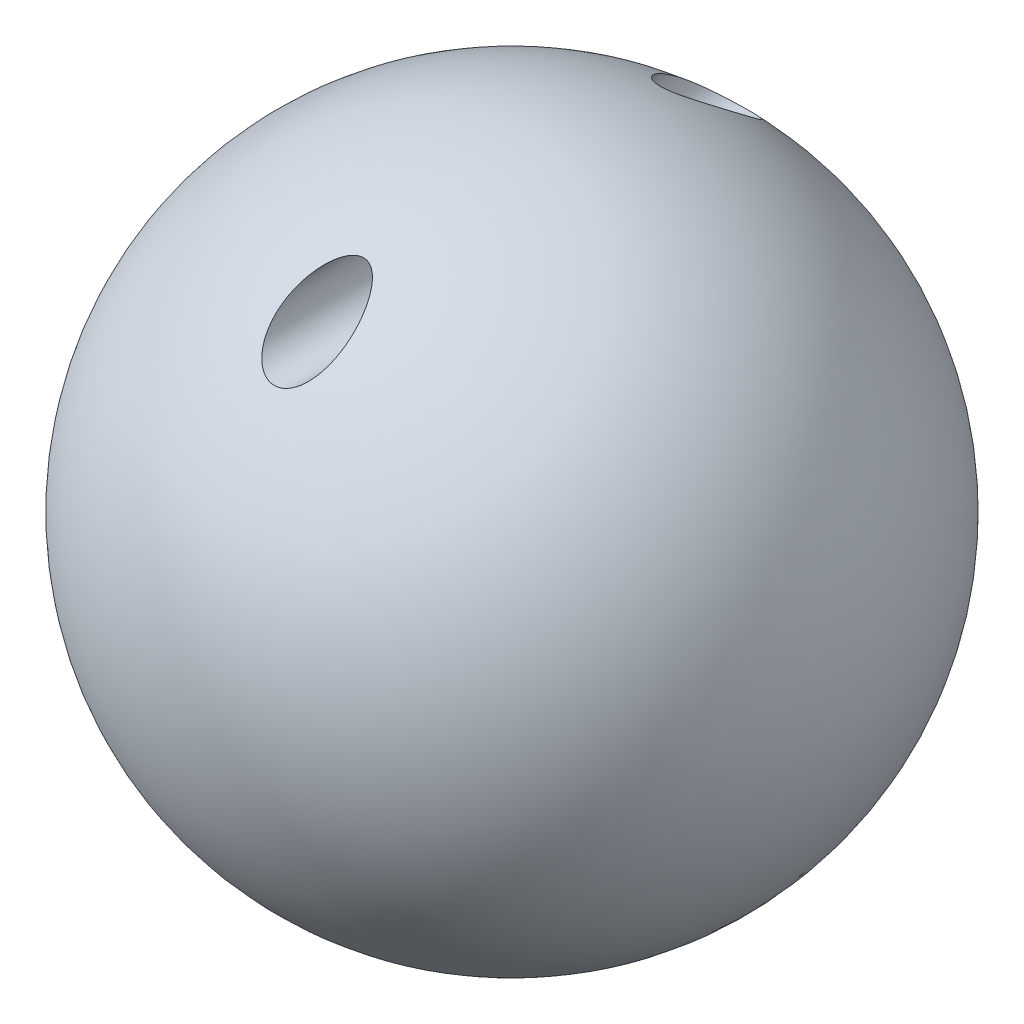
ISO-10303-21;
HEADER;
FILE_DESCRIPTION(('STEP AP214'),'2;1');
FILE_NAME('part.step','',(''),(''),'','','');
FILE_SCHEMA(('AUTOMOTIVE_DESIGN { 1 0 10303 214 1 1 1 1 }'));
ENDSEC;
DATA;
#1=APPLICATION_CONTEXT('core data for automotive mechanical design processes');
#2=APPLICATION_PROTOCOL_DEFINITION('international standard','automotive_design',2000,#1);
#3=PRODUCT_CONTEXT('',#1,'mechanical');
#4=PRODUCT('Part','Part','',(#3));
#5=PRODUCT_RELATED_PRODUCT_CATEGORY('part','',(#4));
#6=PRODUCT_DEFINITION_FORMATION('','',#4);
#7=PRODUCT_DEFINITION_CONTEXT('part definition',#1,'design');
#8=PRODUCT_DEFINITION('design','',#6,#7);
#9=PRODUCT_DEFINITION_SHAPE('','',#8);
#10=(LENGTH_UNIT() NAMED_UNIT(*) SI_UNIT(.MILLI.,.METRE.));
#11=(NAMED_UNIT(*) PLANE_ANGLE_UNIT() SI_UNIT($,.RADIAN.));
#12=(NAMED_UNIT(*) SI_UNIT($,.STERADIAN.) SOLID_ANGLE_UNIT());
#13=UNCERTAINTY_MEASURE_WITH_UNIT(LENGTH_MEASURE(1.E-05),#10,'distance_accuracy_value','');
#14=(GEOMETRIC_REPRESENTATION_CONTEXT(3) GLOBAL_UNCERTAINTY_ASSIGNED_CONTEXT((#13)) GLOBAL_UNIT_ASSIGNED_CONTEXT((#10,
#11,#12)) REPRESENTATION_CONTEXT('',''));
#15=CARTESIAN_POINT('',(0.,0.,0.));
#16=DIRECTION('',(0.,0.,1.));
#17=DIRECTION('',(1.,0.,0.));
#18=AXIS2_PLACEMENT_3D('',#15,#16,#17);
#19=CARTESIAN_POINT('',(0.,12.7,0.));
#20=DIRECTION('',(0.,-1.,0.));
#21=DIRECTION('',(-1.,0.,0.));
#22=AXIS2_PLACEMENT_3D('',#19,#20,#21);
#23=SPHERICAL_SURFACE('',#22,12.7);
#24=CARTESIAN_POINT('',(-0.759351797794241,21.7523752614738,-8.87512706169002));
#25=CARTESIAN_POINT('',(-0.831089058828256,21.8058833851729,-8.81441044199891));
#26=CARTESIAN_POINT('',(-0.893764035284983,21.8643975247287,-8.74737984286509));
#27=CARTESIAN_POINT('',(-1.00279947416906,21.9867451089927,-8.60538313509647));
#28=CARTESIAN_POINT('',(-1.04910022327068,22.0505969941645,-8.53038925231365));
#29=CARTESIAN_POINT('',(-1.14190497129659,22.2048570316088,-8.34660510253561));
#30=CARTESIAN_POINT('',(-1.18213659973077,22.2963442085907,-8.23558257322201));
#31=CARTESIAN_POINT('',(-1.24002629407971,22.479694113766,-8.00825521157405));
#32=CARTESIAN_POINT('',(-1.25765935501729,22.5715571453277,-7.89194467517421));
#33=CARTESIAN_POINT('',(-1.27054365411681,22.7227012819708,-7.69616496293528));
#34=CARTESIAN_POINT('',(-1.2713231152167,22.7825627278406,-7.61744272272749));
#35=CARTESIAN_POINT('',(-1.26465943195577,22.9009523752464,-7.45928794361259));
#36=CARTESIAN_POINT('',(-1.2572127918449,22.9594799991724,-7.37985511696935));
#37=CARTESIAN_POINT('',(-1.23437708432675,23.0747708462184,-7.22081856400652));
#38=CARTESIAN_POINT('',(-1.21898588579238,23.1315335915759,-7.14121479754105));
#39=CARTESIAN_POINT('',(-1.18030194023107,23.242856474525,-6.98246670863399));
#40=CARTESIAN_POINT('',(-1.15701299223983,23.2974176570352,-6.90332218386711));
#41=CARTESIAN_POINT('',(-1.09375369743324,23.4205830722512,-6.72157508373124));
#42=CARTESIAN_POINT('',(-1.05084801541627,23.4882779297423,-6.61933141149009));
#43=CARTESIAN_POINT('',(-0.974802945831967,23.5854245799967,-6.46927236860111));
#44=CARTESIAN_POINT('',(-0.947535090154582,23.6170490551763,-6.41984456759381));
#45=CARTESIAN_POINT('',(-0.888698460913649,23.6786127570565,-6.32253512244491));
#46=CARTESIAN_POINT('',(-0.857131935416161,23.7085528531438,-6.27465268621158));
#47=CARTESIAN_POINT('',(-0.785543464378302,23.7694881619773,-6.17612119924467));
#48=CARTESIAN_POINT('',(-0.744978991916814,23.8002559717045,-6.12572085683274));
#49=CARTESIAN_POINT('',(-0.656929986662447,23.8585339844194,-6.02915145517395));
#50=CARTESIAN_POINT('',(-0.609450174134059,23.886046386447,-5.98297954442653));
#51=CARTESIAN_POINT('',(-0.520225994465285,23.9296763974525,-5.90901644383442));
#52=CARTESIAN_POINT('',(-0.480360528112859,23.9468707706487,-5.87961735140805));
#53=CARTESIAN_POINT('',(-0.395935229509598,23.9778943268155,-5.82623858078711));
#54=CARTESIAN_POINT('',(-0.351384864578416,23.9917301164523,-5.80224826971908));
#55=CARTESIAN_POINT('',(-0.270000418134231,24.0118344641722,-5.76723453872909));
#56=CARTESIAN_POINT('',(-0.234184707323507,24.019135506102,-5.75446107612451));
#57=CARTESIAN_POINT('',(-0.160620439038307,24.0307063188933,-5.73417653749824));
#58=CARTESIAN_POINT('',(-0.122874251737679,24.0349797155472,-5.72665916712313));
#59=CARTESIAN_POINT('',(-0.0461818609156793,24.0401007785508,-5.71764704466955));
#60=CARTESIAN_POINT('',(-0.00722974686346041,24.0409274125914,-5.71618926869011));
#61=CARTESIAN_POINT('',(0.070312782016885,24.0390018181015,-5.71958051832246));
#62=CARTESIAN_POINT('',(0.108903084666963,24.0362485143265,-5.72443143876915));
#63=CARTESIAN_POINT('',(0.181429004468132,24.0278183138549,-5.73924125835918));
#64=CARTESIAN_POINT('',(0.215488819545904,24.02239553028,-5.74875591773294));
#65=CARTESIAN_POINT('',(0.281691904188706,24.0091827595708,-5.77185497928042));
#66=CARTESIAN_POINT('',(0.313834417952959,24.0013918462001,-5.78544097382856));
#67=CARTESIAN_POINT('',(0.396267600785165,23.9781324711754,-5.82581976863976));
#68=CARTESIAN_POINT('',(0.444689068093565,23.9609741642519,-5.85544073776631));
#69=CARTESIAN_POINT('',(0.535754480743906,23.9228839828702,-5.9205880234033));
#70=CARTESIAN_POINT('',(0.578378809676536,23.9019398285198,-5.95613352678529));
#71=CARTESIAN_POINT('',(0.653241987013958,23.8602017732355,-6.02626154975392));
#72=CARTESIAN_POINT('',(0.686111336783283,23.8397362770708,-6.06037794422098));
#73=CARTESIAN_POINT('',(0.748340185077619,23.7971512438757,-6.13073284296164));
#74=CARTESIAN_POINT('',(0.777697025905952,23.7750304747163,-6.1669729235948));
#75=CARTESIAN_POINT('',(0.861143183980542,23.7065891910786,-6.2780636955337));
#76=CARTESIAN_POINT('',(0.910531123599127,23.658235146698,-6.35520812099951));
#77=CARTESIAN_POINT('',(0.992604724565551,23.5646686234327,-6.50166350009603));
#78=CARTESIAN_POINT('',(1.02666048908448,23.5199632982005,-6.57056012379359));
#79=CARTESIAN_POINT('',(1.08780274335829,23.4281034005208,-6.70987160133703));
#80=CARTESIAN_POINT('',(1.1148845541012,23.3809472090838,-6.78028744031282));
#81=CARTESIAN_POINT('',(1.16250441116428,23.2845319233708,-6.92200787067093));
#82=CARTESIAN_POINT('',(1.18303409233275,23.2352702312003,-6.99331347836406));
#83=CARTESIAN_POINT('',(1.21768347557356,23.1349936600665,-7.13625082825087));
#84=CARTESIAN_POINT('',(1.23180280406911,23.0839786791129,-7.20788258920616));
#85=CARTESIAN_POINT('',(1.25406887893222,22.978315141959,-7.35405649266067));
#86=CARTESIAN_POINT('',(1.26194151046636,22.9236038193301,-7.42859522109121));
#87=CARTESIAN_POINT('',(1.2705006681116,22.8129062679086,-7.57717347254307));
#88=CARTESIAN_POINT('',(1.27118536505793,22.7569197182323,-7.65121286370435));
#89=CARTESIAN_POINT('',(1.26497575524037,22.6441979165995,-7.79816188662278));
#90=CARTESIAN_POINT('',(1.25809795201244,22.5874645608615,-7.87107362774595));
#91=CARTESIAN_POINT('',(1.23621541120595,22.4736641143297,-8.01534887923764));
#92=CARTESIAN_POINT('',(1.2212155709584,22.4165972451246,-8.08671329565273));
#93=CARTESIAN_POINT('',(1.17836773838381,22.2911981530331,-8.24152566417569));
#94=CARTESIAN_POINT('',(1.14853183711695,22.2229269753233,-8.32449104908718));
#95=CARTESIAN_POINT('',(1.0741983004497,22.0885295598913,-8.4855143814937));
#96=CARTESIAN_POINT('',(1.02971734779738,22.0224009751725,-8.5635777930916));
#97=CARTESIAN_POINT('',(0.937442163095681,21.9113478084707,-8.69305101851205));
#98=CARTESIAN_POINT('',(0.89340024794441,21.8653234836712,-8.746173787132));
#99=CARTESIAN_POINT('',(0.79502947464889,21.777810478838,-8.84636066361251));
#100=CARTESIAN_POINT('',(0.740717044953758,21.7363147199571,-8.8934342483387));
#101=CARTESIAN_POINT('',(0.6373516153123,21.6706481570639,-8.96743643028945));
#102=CARTESIAN_POINT('',(0.590805552649485,21.6448178703274,-8.99637954455755));
#103=CARTESIAN_POINT('',(0.492113492455593,21.598312118188,-9.04828721843975));
#104=CARTESIAN_POINT('',(0.439974821247918,21.577630023857,-9.07125946797574));
#105=CARTESIAN_POINT('',(0.339575790572393,21.5456495322534,-9.10668742288085));
#106=CARTESIAN_POINT('',(0.292012416422369,21.5333829853581,-9.12023335993143));
#107=CARTESIAN_POINT('',(0.194485297981032,21.5143556026731,-9.14121901177985));
#108=CARTESIAN_POINT('',(0.144522986758856,21.5075915221268,-9.14866232526223));
#109=CARTESIAN_POINT('',(0.0434283489908119,21.5000846095089,-9.15692194749231));
#110=CARTESIAN_POINT('',(-0.00770725563608416,21.4993614413248,-9.15771661411772));
#111=CARTESIAN_POINT('',(-0.109350638643128,21.5040500563831,-9.15255922170204));
#112=CARTESIAN_POINT('',(-0.159858341673482,21.5094625688737,-9.14660636069241));
#113=CARTESIAN_POINT('',(-0.256286938164514,21.5255708294883,-9.12885331415026));
#114=CARTESIAN_POINT('',(-0.302311207846917,21.5359930327777,-9.11735578852007));
#115=CARTESIAN_POINT('',(-0.391489538155548,21.561312114123,-9.08934712728224));
#116=CARTESIAN_POINT('',(-0.434642689034997,21.5762104023074,-9.0728344116907));
#117=CARTESIAN_POINT('',(-0.529168968586325,21.6144332732449,-9.03032132371822));
#118=CARTESIAN_POINT('',(-0.579445241785287,21.6389492585161,-9.00295879001738));
#119=CARTESIAN_POINT('',(-0.673934698953961,21.6925466795122,-8.94280650987586));
#120=CARTESIAN_POINT('',(-0.718138752228329,21.7216348525374,-8.91000875047866));
#121=CARTESIAN_POINT('',(-0.759351797794241,21.7523752614738,-8.87512706169002));
#122=B_SPLINE_CURVE_WITH_KNOTS('',3,(#24,#25,#26,#27,#28,#29,#30,#31,#32,#33,#34,#35,#36,#37,
#38,#39,#40,#41,#42,#43,#44,#45,#46,#47,#48,#49,#50,#51,#52,#53,#54,#55,#56,#57,#58,#59,#60,#61,
#62,#63,#64,#65,#66,#67,#68,#69,#70,#71,#72,#73,#74,#75,#76,#77,#78,#79,#80,#81,#82,#83,#84,#85,
#86,#87,#88,#89,#90,#91,#92,#93,#94,#95,#96,#97,#98,#99,#100,#101,#102,#103,#104,#105,#106,#107,
#108,#109,#110,#111,#112,#113,#114,#115,#116,#117,#118,#119,#120,#121),.UNSPECIFIED.,.T.,.F.,(4,
2,2,2,2,2,2,2,2,2,2,2,2,2,2,2,2,2,2,2,2,2,2,2,2,2,2,2,2,2,2,2,2,2,2,2,2,2,2,2,2,2,2,2,2,2,2,2,
4),(0.,0.324137467442311,0.64944509324837,1.095202474206,1.54145265441579,1.83782070004572,
2.134314738205,2.43088835222893,2.72731950803227,3.11593407285025,3.30991034098543,
3.50378555258254,3.71831520803511,3.93269911045344,4.08956498787739,4.24611974758836,
4.36183886093185,4.47741915815747,4.59370370893176,4.71002319416874,4.81694712161643,
4.92391292369098,5.10079059017195,5.27825262820153,5.43284721764651,5.58755804922695,
5.89732965705319,6.16375608217043,6.43036079689457,6.69730453869175,6.964263835201,
7.24237423133359,7.52055539847918,7.79813069754903,8.07553881358165,8.40917309894067,
8.74242863589575,8.99051120149663,9.23820024688896,9.41934761224599,9.60026050738471,
9.75247216628599,9.90459400209488,10.0572108203721,10.2098457796232,10.3549577703235,
10.5001155245646,10.6860558460027,10.8722727718062),.UNSPECIFIED.);
#123=CARTESIAN_POINT('',(-0.759351797794241,21.7523752614738,-8.87512706169002));
#124=VERTEX_POINT('',#123);
#125=EDGE_CURVE('E10',#124,#124,#122,.T.);
#126=ORIENTED_EDGE('',*,*,#125,.F.);
#127=EDGE_LOOP('',(#126));
#128=FACE_BOUND('',#127,.T.);
#129=CARTESIAN_POINT('',(-0.748903787775618,23.7960478867129,6.13244359227455));
#130=CARTESIAN_POINT('',(-0.789344891051309,23.7665194690947,6.1809334169247));
#131=CARTESIAN_POINT('',(-0.826698606009021,23.7356012980268,6.23112578559873));
#132=CARTESIAN_POINT('',(-0.896078593283216,23.671562250709,6.33377736958984));
#133=CARTESIAN_POINT('',(-0.92809956799244,23.6384392293062,6.38623877460579));
#134=CARTESIAN_POINT('',(-0.987462303758178,23.5702731021887,6.4928407426746));
#135=CARTESIAN_POINT('',(-1.01478727448205,23.5352236747657,6.54698654569993));
#136=CARTESIAN_POINT('',(-1.06502209966097,23.4635675558474,6.656293741801));
#137=CARTESIAN_POINT('',(-1.0879306539695,23.4269604096361,6.71145542872245));
#138=CARTESIAN_POINT('',(-1.13826437078993,23.3368525002007,6.84555020284903));
#139=CARTESIAN_POINT('',(-1.16359611183948,23.282666420702,6.92481415748503));
#140=CARTESIAN_POINT('',(-1.20627451561522,23.1720009995018,7.08392215433782));
#141=CARTESIAN_POINT('',(-1.22361723606885,23.1155205405395,7.16376646323969));
#142=CARTESIAN_POINT('',(-1.2503193489928,23.0007247756731,7.3233594696707));
#143=CARTESIAN_POINT('',(-1.25968689826051,22.9424114078898,7.40310818138258));
#144=CARTESIAN_POINT('',(-1.27023433890186,22.8243511535751,7.56200061510095));
#145=CARTESIAN_POINT('',(-1.27141771553251,22.7646048881266,7.64114458029588));
#146=CARTESIAN_POINT('',(-1.2635533451745,22.6134110832013,7.83836762461399));
#147=CARTESIAN_POINT('',(-1.24900461749094,22.5212730493467,7.95580812275296));
#148=CARTESIAN_POINT('',(-1.21048925353388,22.3832037826667,8.12809160305783));
#149=CARTESIAN_POINT('',(-1.19488049811696,22.337226181411,8.18484632315577));
#150=CARTESIAN_POINT('',(-1.15761928304196,22.2457053551294,8.29668523349348));
#151=CARTESIAN_POINT('',(-1.1359695982085,22.2001619405748,8.35177017787497));
#152=CARTESIAN_POINT('',(-1.07883643644241,22.0969834977312,8.47538035385375));
#153=CARTESIAN_POINT('',(-1.04116264997514,22.0396637691645,8.54318139473562));
#154=CARTESIAN_POINT('',(-0.953410171362163,21.9283826453513,8.67336099106513));
#155=CARTESIAN_POINT('',(-0.903347325371924,21.8744170694644,8.73574633680019));
#156=CARTESIAN_POINT('',(-0.804346369829058,21.7859269679636,8.83708063993423));
#157=CARTESIAN_POINT('',(-0.75856227153351,21.750017594862,8.87788305285664));
#158=CARTESIAN_POINT('',(-0.659068575513974,21.6831081515267,8.95345729632326));
#159=CARTESIAN_POINT('',(-0.60537114906547,21.6521006909658,8.98823821280514));
#160=CARTESIAN_POINT('',(-0.50301939133601,21.6031644817089,9.04287987242717));
#161=CARTESIAN_POINT('',(-0.455884072582832,21.5838601483929,9.06433896360357));
#162=CARTESIAN_POINT('',(-0.357501281729351,21.5506097919387,9.1012047994654));
#163=CARTESIAN_POINT('',(-0.306256558442905,21.5366602225076,9.11661554993017));
#164=CARTESIAN_POINT('',(-0.200409850320433,21.515099043376,9.14040184436368));
#165=CARTESIAN_POINT('',(-0.145785484916785,21.5075359646872,9.14872352253025));
#166=CARTESIAN_POINT('',(-0.0353938632594128,21.4996467884256,9.15740358142349));
#167=CARTESIAN_POINT('',(0.0203727391359967,21.4993166602734,9.15776639724582));
#168=CARTESIAN_POINT('',(0.124323756324371,21.5055126884938,9.15094981051725));
#169=CARTESIAN_POINT('',(0.172620734682751,21.511227614922,9.14466280185211));
#170=CARTESIAN_POINT('',(0.267171327681377,21.5278490435021,9.12634038863264));
#171=CARTESIAN_POINT('',(0.31342464978852,21.5387562862787,9.11430416401747));
#172=CARTESIAN_POINT('',(0.404403996504967,21.5654990516773,9.08470865352377));
#173=CARTESIAN_POINT('',(0.449030045104836,21.5814845977363,9.06698103634712));
#174=CARTESIAN_POINT('',(0.534502982821485,21.617377822476,9.02702789852863));
#175=CARTESIAN_POINT('',(0.575347965312282,21.6372874642431,9.00480012646639));
#176=CARTESIAN_POINT('',(0.67514435233009,21.6924286492258,8.9429675443562));
#177=CARTESIAN_POINT('',(0.731178330006218,21.7299334308033,8.90067056065449));
#178=CARTESIAN_POINT('',(0.833576800514463,21.8099940676754,8.80962508618831));
#179=CARTESIAN_POINT('',(0.879915615397351,21.8525628794832,8.76086000829497));
#180=CARTESIAN_POINT('',(0.983613786921004,21.9619668838136,8.63436270090984));
#181=CARTESIAN_POINT('',(1.03566309401489,22.0306799548638,8.55392101201459));
#182=CARTESIAN_POINT('',(1.12282335138632,22.1711764181564,8.38689164099411));
#183=CARTESIAN_POINT('',(1.15790658261995,22.2429646276722,8.30029416451936));
#184=CARTESIAN_POINT('',(1.20603005044078,22.3683267541861,8.14656084641046));
#185=CARTESIAN_POINT('',(1.22244085744356,22.421725866191,8.08029598218748));
#186=CARTESIAN_POINT('',(1.247945701888,22.5284021779326,7.94623463765644));
#187=CARTESIAN_POINT('',(1.25703627329902,22.581679308022,7.87843744741343));
#188=CARTESIAN_POINT('',(1.26843131492768,22.687715385684,7.74171517641934));
#189=CARTESIAN_POINT('',(1.27072462413405,22.7404733393953,7.67278842729806));
#190=CARTESIAN_POINT('',(1.268880277072,22.8450383219786,7.53429958836917));
#191=CARTESIAN_POINT('',(1.26474190835234,22.8968452448597,7.46473742902433));
#192=CARTESIAN_POINT('',(1.25004310913229,23.0008817409742,7.32306337967568));
#193=CARTESIAN_POINT('',(1.23927736587832,23.0530698652053,7.25094241005874));
#194=CARTESIAN_POINT('',(1.2112664839321,23.155800642541,7.1068339859404));
#195=CARTESIAN_POINT('',(1.19402414650922,23.2063439967892,7.03484648721822));
#196=CARTESIAN_POINT('',(1.15303523839248,23.3054054051823,6.89157981222592));
#197=CARTESIAN_POINT('',(1.12930365985024,23.3539278341274,6.82029939100241));
#198=CARTESIAN_POINT('',(1.0750411033307,23.4487136263619,6.67887846178053));
#199=CARTESIAN_POINT('',(1.04451425508346,23.4949783410125,6.60873728908217));
#200=CARTESIAN_POINT('',(0.9763437705155,23.5844783385322,6.47091451883596));
#201=CARTESIAN_POINT('',(0.938760152276549,23.6277352348426,6.40321753667536));
#202=CARTESIAN_POINT('',(0.855285326011766,23.711032212784,6.27084588906288));
#203=CARTESIAN_POINT('',(0.809389153453868,23.7510703513218,6.20617305893357));
#204=CARTESIAN_POINT('',(0.715267386317381,23.8211710867102,6.09127790848964));
#205=CARTESIAN_POINT('',(0.668386625621514,23.8518336810583,6.04033196969561));
#206=CARTESIAN_POINT('',(0.566153387595595,23.9086787973175,5.94480018973523));
#207=CARTESIAN_POINT('',(0.510828761302078,23.9348754691281,5.90019433814309));
#208=CARTESIAN_POINT('',(0.416395291914045,23.9707116744736,5.83862345750261));
#209=CARTESIAN_POINT('',(0.380544122080039,23.9826268344879,5.81802081689039));
#210=CARTESIAN_POINT('',(0.305696280303969,24.0036275583302,5.78155618539546));
#211=CARTESIAN_POINT('',(0.266701896901952,24.0127151578588,5.76569078427323));
#212=CARTESIAN_POINT('',(0.185526779095811,24.0274153580434,5.73995912005117));
#213=CARTESIAN_POINT('',(0.143311965378712,24.0329825256121,5.7301713196465));
#214=CARTESIAN_POINT('',(0.0574876040409439,24.0397806514616,5.71821238561247));
#215=CARTESIAN_POINT('',(0.0138803300899742,24.0410183469594,5.71602941790412));
#216=CARTESIAN_POINT('',(-0.0663989710187778,24.0391591406156,5.71930319071255));
#217=CARTESIAN_POINT('',(-0.103136417763026,24.0366804894247,5.72367030131458));
#218=CARTESIAN_POINT('',(-0.175267204487045,24.0287285260208,5.73764400375485));
#219=CARTESIAN_POINT('',(-0.210659326539841,24.023252566283,5.74725522769825));
#220=CARTESIAN_POINT('',(-0.290654771131251,24.0075236417664,5.77475838062784));
#221=CARTESIAN_POINT('',(-0.334480569265625,23.9962936951169,5.7943311158359));
#222=CARTESIAN_POINT('',(-0.417995666737188,23.9703991391315,5.83916165636246));
#223=CARTESIAN_POINT('',(-0.457675907166035,23.9557272262716,5.86443154599254));
#224=CARTESIAN_POINT('',(-0.543733855503687,23.9192766543959,5.92673350367666));
#225=CARTESIAN_POINT('',(-0.588800800484032,23.8966640242979,5.96506582339421));
#226=CARTESIAN_POINT('',(-0.673060750342281,23.8484319188609,6.04594548903583));
#227=CARTESIAN_POINT('',(-0.712250343782724,23.8228107124941,6.08849525931431));
#228=CARTESIAN_POINT('',(-0.748903787775618,23.7960478867129,6.13244359227455));
#229=B_SPLINE_CURVE_WITH_KNOTS('',3,(#129,#130,#131,#132,#133,#134,#135,#136,#137,#138,#139,
#140,#141,#142,#143,#144,#145,#146,#147,#148,#149,#150,#151,#152,#153,#154,#155,#156,#157,#158,
#159,#160,#161,#162,#163,#164,#165,#166,#167,#168,#169,#170,#171,#172,#173,#174,#175,#176,#177,
#178,#179,#180,#181,#182,#183,#184,#185,#186,#187,#188,#189,#190,#191,#192,#193,#194,#195,#196,
#197,#198,#199,#200,#201,#202,#203,#204,#205,#206,#207,#208,#209,#210,#211,#212,#213,#214,#215,
#216,#217,#218,#219,#220,#221,#222,#223,#224,#225,#226,#227,#228),.UNSPECIFIED.,.T.,.F.,(4,2,2,
2,2,2,2,2,2,2,2,2,2,2,2,2,2,2,2,2,2,2,2,2,2,2,2,2,2,2,2,2,2,2,2,2,2,2,2,2,2,2,2,2,2,2,2,2,2,4),
(0.,0.209023534105182,0.418253491796305,0.628216643056935,0.838241511186057,1.13575024793698,
1.43340563688794,1.73075622467186,2.02798017692165,2.47614666106897,2.70001034836506,
2.92377137550178,3.21229267449893,3.50044683223237,3.71296497240896,3.9251595912731,
4.09033565563412,4.25540213953946,4.42171195778669,4.5879290971221,4.73436622445421,
4.88082424563193,5.03208992498632,5.18343147016886,5.42086484839262,5.65891933114245,
6.01069365998071,6.36304078945654,6.62272701892372,6.88253613406048,7.14277161651495,
7.40303592788569,7.67179973182724,7.94044742312064,8.20847962403974,8.4763493747203,
8.74203638835405,9.00788260545077,9.23447103536554,9.46032762882201,9.58905914248081,
9.71769776034737,9.8479643556932,9.97802814901354,10.0887165784884,10.1995029372797,
10.3465572823836,10.4939265311074,10.6832637257959,10.8727103971266),.UNSPECIFIED.);
#230=CARTESIAN_POINT('',(-0.748903787775618,23.7960478867129,6.13244359227455));
#231=VERTEX_POINT('',#230);
#232=EDGE_CURVE('E54',#231,#231,#229,.T.);
#233=ORIENTED_EDGE('',*,*,#232,.F.);
#234=EDGE_LOOP('',(#233));
#235=FACE_BOUND('',#234,.T.);
#236=ADVANCED_FACE('F43',(#128,#235),#23,.T.);
#237=CARTESIAN_POINT('',(0.,22.7703563557663,-12.7));
#238=DIRECTION('',(0.,0.,1.));
#239=DIRECTION('',(1.,0.,0.));
#240=AXIS2_PLACEMENT_3D('',#237,#238,#239);
#241=CYLINDRICAL_SURFACE('',#240,1.27);
#242=ORIENTED_EDGE('',*,*,#125,.T.);
#243=EDGE_LOOP('',(#242));
#244=FACE_BOUND('',#243,.T.);
#245=ORIENTED_EDGE('',*,*,#232,.T.);
#246=EDGE_LOOP('',(#245));
#247=FACE_BOUND('',#246,.T.);
#248=ADVANCED_FACE('F64',(#244,#247),#241,.F.);
#249=CLOSED_SHELL('',(#236,#248));
#250=MANIFOLD_SOLID_BREP('B2',#249);
#251=ADVANCED_BREP_SHAPE_REPRESENTATION('',(#18,#250),#14);
#252=SHAPE_DEFINITION_REPRESENTATION(#9,#251);
ENDSEC;
END-ISO-10303-21;
